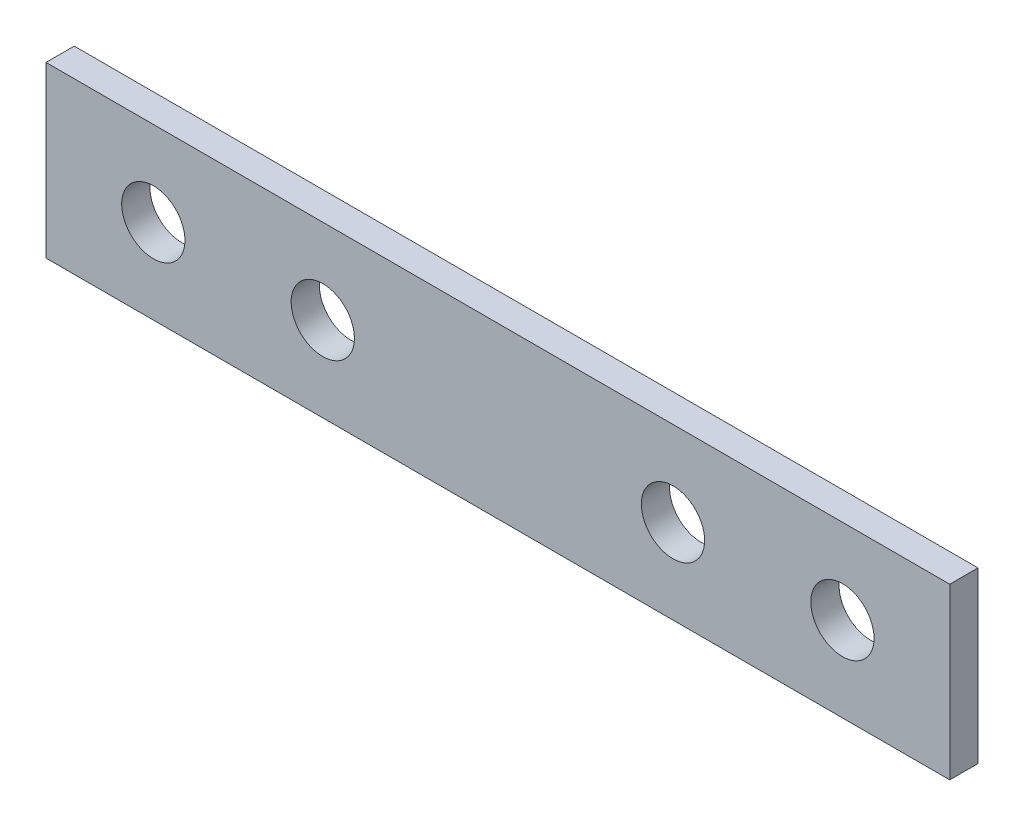
ISO-10303-21;
HEADER;
FILE_DESCRIPTION(('STEP AP214'),'2;1');
FILE_NAME('part.step','',(''),(''),'','','');
FILE_SCHEMA(('AUTOMOTIVE_DESIGN { 1 0 10303 214 1 1 1 1 }'));
ENDSEC;
DATA;
#1=APPLICATION_CONTEXT('core data for automotive mechanical design processes');
#2=APPLICATION_PROTOCOL_DEFINITION('international standard','automotive_design',2000,#1);
#3=PRODUCT_CONTEXT('',#1,'mechanical');
#4=PRODUCT('Part','Part','',(#3));
#5=PRODUCT_RELATED_PRODUCT_CATEGORY('part','',(#4));
#6=PRODUCT_DEFINITION_FORMATION('','',#4);
#7=PRODUCT_DEFINITION_CONTEXT('part definition',#1,'design');
#8=PRODUCT_DEFINITION('design','',#6,#7);
#9=PRODUCT_DEFINITION_SHAPE('','',#8);
#10=(LENGTH_UNIT() NAMED_UNIT(*) SI_UNIT(.MILLI.,.METRE.));
#11=(NAMED_UNIT(*) PLANE_ANGLE_UNIT() SI_UNIT($,.RADIAN.));
#12=(NAMED_UNIT(*) SI_UNIT($,.STERADIAN.) SOLID_ANGLE_UNIT());
#13=UNCERTAINTY_MEASURE_WITH_UNIT(LENGTH_MEASURE(1.E-05),#10,'distance_accuracy_value','');
#14=(GEOMETRIC_REPRESENTATION_CONTEXT(3) GLOBAL_UNCERTAINTY_ASSIGNED_CONTEXT((#13)) GLOBAL_UNIT_ASSIGNED_CONTEXT((#10,
#11,#12)) REPRESENTATION_CONTEXT('',''));
#15=CARTESIAN_POINT('',(0.,0.,0.));
#16=DIRECTION('',(0.,0.,1.));
#17=DIRECTION('',(1.,0.,0.));
#18=AXIS2_PLACEMENT_3D('',#15,#16,#17);
#19=CARTESIAN_POINT('',(40.,7.5,2.5));
#20=DIRECTION('',(0.,0.,1.));
#21=DIRECTION('',(1.,0.,0.));
#22=AXIS2_PLACEMENT_3D('',#19,#20,#21);
#23=PLANE('',#22);
#24=CARTESIAN_POINT('',(-30.5,0.,2.5));
#25=DIRECTION('',(0.,0.,1.));
#26=DIRECTION('',(1.,0.,0.));
#27=AXIS2_PLACEMENT_3D('',#24,#25,#26);
#28=CIRCLE('',#27,2.8);
#29=CARTESIAN_POINT('',(-27.7,0.,2.5));
#30=VERTEX_POINT('',#29);
#31=EDGE_CURVE('E121',#30,#30,#28,.T.);
#32=ORIENTED_EDGE('',*,*,#31,.F.);
#33=EDGE_LOOP('',(#32));
#34=FACE_BOUND('',#33,.T.);
#35=DIRECTION('',(0.,1.,0.));
#36=VECTOR('',#35,1.);
#37=CARTESIAN_POINT('',(40.,-7.5,2.5));
#38=LINE('',#37,#36);
#39=CARTESIAN_POINT('',(40.,-7.5,2.5));
#40=VERTEX_POINT('',#39);
#41=CARTESIAN_POINT('',(40.,7.5,2.5));
#42=VERTEX_POINT('',#41);
#43=EDGE_CURVE('E102',#40,#42,#38,.T.);
#44=ORIENTED_EDGE('',*,*,#43,.T.);
#45=DIRECTION('',(-1.,0.,0.));
#46=VECTOR('',#45,1.);
#47=CARTESIAN_POINT('',(-40.,7.5,2.5));
#48=LINE('',#47,#46);
#49=CARTESIAN_POINT('',(-40.,7.5,2.5));
#50=VERTEX_POINT('',#49);
#51=EDGE_CURVE('E72',#42,#50,#48,.T.);
#52=ORIENTED_EDGE('',*,*,#51,.T.);
#53=DIRECTION('',(0.,-1.,0.));
#54=VECTOR('',#53,1.);
#55=CARTESIAN_POINT('',(-40.,-7.5,2.5));
#56=LINE('',#55,#54);
#57=CARTESIAN_POINT('',(-40.,-7.5,2.5));
#58=VERTEX_POINT('',#57);
#59=EDGE_CURVE('E111',#50,#58,#56,.T.);
#60=ORIENTED_EDGE('',*,*,#59,.T.);
#61=DIRECTION('',(1.,0.,0.));
#62=VECTOR('',#61,1.);
#63=CARTESIAN_POINT('',(-40.,-7.5,2.5));
#64=LINE('',#63,#62);
#65=EDGE_CURVE('E96',#58,#40,#64,.T.);
#66=ORIENTED_EDGE('',*,*,#65,.T.);
#67=EDGE_LOOP('',(#44,#52,#60,#66));
#68=FACE_BOUND('',#67,.T.);
#69=CARTESIAN_POINT('',(-15.5,0.,2.5));
#70=DIRECTION('',(0.,0.,1.));
#71=DIRECTION('',(1.,0.,0.));
#72=AXIS2_PLACEMENT_3D('',#69,#70,#71);
#73=CIRCLE('',#72,2.8);
#74=CARTESIAN_POINT('',(-12.7,0.,2.5));
#75=VERTEX_POINT('',#74);
#76=EDGE_CURVE('E123',#75,#75,#73,.T.);
#77=ORIENTED_EDGE('',*,*,#76,.F.);
#78=EDGE_LOOP('',(#77));
#79=FACE_BOUND('',#78,.T.);
#80=CARTESIAN_POINT('',(15.5,0.,2.5));
#81=DIRECTION('',(0.,0.,1.));
#82=DIRECTION('',(1.,0.,0.));
#83=AXIS2_PLACEMENT_3D('',#80,#81,#82);
#84=CIRCLE('',#83,2.8);
#85=CARTESIAN_POINT('',(18.3,0.,2.5));
#86=VERTEX_POINT('',#85);
#87=EDGE_CURVE('E41',#86,#86,#84,.T.);
#88=ORIENTED_EDGE('',*,*,#87,.F.);
#89=EDGE_LOOP('',(#88));
#90=FACE_BOUND('',#89,.T.);
#91=CARTESIAN_POINT('',(30.5,0.,2.5));
#92=DIRECTION('',(0.,0.,1.));
#93=DIRECTION('',(1.,0.,0.));
#94=AXIS2_PLACEMENT_3D('',#91,#92,#93);
#95=CIRCLE('',#94,2.8);
#96=CARTESIAN_POINT('',(33.3,0.,2.5));
#97=VERTEX_POINT('',#96);
#98=EDGE_CURVE('E128',#97,#97,#95,.T.);
#99=ORIENTED_EDGE('',*,*,#98,.F.);
#100=EDGE_LOOP('',(#99));
#101=FACE_BOUND('',#100,.T.);
#102=ADVANCED_FACE('F37',(#34,#68,#79,#90,#101),#23,.T.);
#103=CARTESIAN_POINT('',(-40.,7.5,2.5));
#104=DIRECTION('',(0.,-1.,0.));
#105=DIRECTION('',(0.,0.,-1.));
#106=AXIS2_PLACEMENT_3D('',#103,#104,#105);
#107=PLANE('',#106);
#108=DIRECTION('',(-1.,0.,0.));
#109=VECTOR('',#108,1.);
#110=CARTESIAN_POINT('',(-40.,7.5,0.));
#111=LINE('',#110,#109);
#112=CARTESIAN_POINT('',(40.,7.5,0.));
#113=VERTEX_POINT('',#112);
#114=CARTESIAN_POINT('',(-40.,7.5,0.));
#115=VERTEX_POINT('',#114);
#116=EDGE_CURVE('E56',#113,#115,#111,.T.);
#117=ORIENTED_EDGE('',*,*,#116,.T.);
#118=DIRECTION('',(0.,0.,-1.));
#119=VECTOR('',#118,1.);
#120=CARTESIAN_POINT('',(-40.,7.5,2.5));
#121=LINE('',#120,#119);
#122=EDGE_CURVE('E93',#50,#115,#121,.T.);
#123=ORIENTED_EDGE('',*,*,#122,.F.);
#124=ORIENTED_EDGE('',*,*,#51,.F.);
#125=DIRECTION('',(0.,0.,-1.));
#126=VECTOR('',#125,1.);
#127=CARTESIAN_POINT('',(40.,7.5,2.5));
#128=LINE('',#127,#126);
#129=EDGE_CURVE('E132',#42,#113,#128,.T.);
#130=ORIENTED_EDGE('',*,*,#129,.T.);
#131=EDGE_LOOP('',(#117,#123,#124,#130));
#132=FACE_BOUND('',#131,.T.);
#133=ADVANCED_FACE('F139',(#132),#107,.F.);
#134=CARTESIAN_POINT('',(-40.,-7.5,2.5));
#135=DIRECTION('',(1.,0.,0.));
#136=DIRECTION('',(0.,0.,-1.));
#137=AXIS2_PLACEMENT_3D('',#134,#135,#136);
#138=PLANE('',#137);
#139=DIRECTION('',(0.,-1.,0.));
#140=VECTOR('',#139,1.);
#141=CARTESIAN_POINT('',(-40.,-7.5,0.));
#142=LINE('',#141,#140);
#143=CARTESIAN_POINT('',(-40.,-7.5,0.));
#144=VERTEX_POINT('',#143);
#145=EDGE_CURVE('E88',#115,#144,#142,.T.);
#146=ORIENTED_EDGE('',*,*,#145,.T.);
#147=DIRECTION('',(0.,0.,-1.));
#148=VECTOR('',#147,1.);
#149=CARTESIAN_POINT('',(-40.,-7.5,2.5));
#150=LINE('',#149,#148);
#151=EDGE_CURVE('E91',#58,#144,#150,.T.);
#152=ORIENTED_EDGE('',*,*,#151,.F.);
#153=ORIENTED_EDGE('',*,*,#59,.F.);
#154=ORIENTED_EDGE('',*,*,#122,.T.);
#155=EDGE_LOOP('',(#146,#152,#153,#154));
#156=FACE_BOUND('',#155,.T.);
#157=ADVANCED_FACE('F89',(#156),#138,.F.);
#158=CARTESIAN_POINT('',(40.,-7.5,2.5));
#159=DIRECTION('',(-1.,0.,0.));
#160=DIRECTION('',(0.,0.,1.));
#161=AXIS2_PLACEMENT_3D('',#158,#159,#160);
#162=PLANE('',#161);
#163=DIRECTION('',(0.,1.,0.));
#164=VECTOR('',#163,1.);
#165=CARTESIAN_POINT('',(40.,-7.5,0.));
#166=LINE('',#165,#164);
#167=CARTESIAN_POINT('',(40.,-7.5,0.));
#168=VERTEX_POINT('',#167);
#169=EDGE_CURVE('E101',#168,#113,#166,.T.);
#170=ORIENTED_EDGE('',*,*,#169,.T.);
#171=ORIENTED_EDGE('',*,*,#129,.F.);
#172=ORIENTED_EDGE('',*,*,#43,.F.);
#173=DIRECTION('',(0.,0.,-1.));
#174=VECTOR('',#173,1.);
#175=CARTESIAN_POINT('',(40.,-7.5,2.5));
#176=LINE('',#175,#174);
#177=EDGE_CURVE('E97',#40,#168,#176,.T.);
#178=ORIENTED_EDGE('',*,*,#177,.T.);
#179=EDGE_LOOP('',(#170,#171,#172,#178));
#180=FACE_BOUND('',#179,.T.);
#181=ADVANCED_FACE('F142',(#180),#162,.F.);
#182=CARTESIAN_POINT('',(-30.5,0.,0.));
#183=DIRECTION('',(0.,0.,-1.));
#184=DIRECTION('',(-1.,0.,0.));
#185=AXIS2_PLACEMENT_3D('',#182,#183,#184);
#186=PLANE('',#185);
#187=CARTESIAN_POINT('',(-30.5,0.,0.));
#188=DIRECTION('',(0.,0.,1.));
#189=DIRECTION('',(1.,0.,0.));
#190=AXIS2_PLACEMENT_3D('',#187,#188,#189);
#191=CIRCLE('',#190,2.8);
#192=CARTESIAN_POINT('',(-27.7,0.,0.));
#193=VERTEX_POINT('',#192);
#194=EDGE_CURVE('E109',#193,#193,#191,.T.);
#195=ORIENTED_EDGE('',*,*,#194,.T.);
#196=EDGE_LOOP('',(#195));
#197=FACE_BOUND('',#196,.T.);
#198=CARTESIAN_POINT('',(-15.5,0.,0.));
#199=DIRECTION('',(0.,0.,1.));
#200=DIRECTION('',(1.,0.,0.));
#201=AXIS2_PLACEMENT_3D('',#198,#199,#200);
#202=CIRCLE('',#201,2.8);
#203=CARTESIAN_POINT('',(-12.7,0.,0.));
#204=VERTEX_POINT('',#203);
#205=EDGE_CURVE('E116',#204,#204,#202,.T.);
#206=ORIENTED_EDGE('',*,*,#205,.T.);
#207=EDGE_LOOP('',(#206));
#208=FACE_BOUND('',#207,.T.);
#209=CARTESIAN_POINT('',(15.5,0.,0.));
#210=DIRECTION('',(0.,0.,1.));
#211=DIRECTION('',(1.,0.,0.));
#212=AXIS2_PLACEMENT_3D('',#209,#210,#211);
#213=CIRCLE('',#212,2.8);
#214=CARTESIAN_POINT('',(18.3,0.,0.));
#215=VERTEX_POINT('',#214);
#216=EDGE_CURVE('E47',#215,#215,#213,.T.);
#217=ORIENTED_EDGE('',*,*,#216,.T.);
#218=EDGE_LOOP('',(#217));
#219=FACE_BOUND('',#218,.T.);
#220=CARTESIAN_POINT('',(30.5,0.,0.));
#221=DIRECTION('',(0.,0.,1.));
#222=DIRECTION('',(1.,0.,0.));
#223=AXIS2_PLACEMENT_3D('',#220,#221,#222);
#224=CIRCLE('',#223,2.8);
#225=CARTESIAN_POINT('',(33.3,0.,0.));
#226=VERTEX_POINT('',#225);
#227=EDGE_CURVE('E11',#226,#226,#224,.T.);
#228=ORIENTED_EDGE('',*,*,#227,.T.);
#229=EDGE_LOOP('',(#228));
#230=FACE_BOUND('',#229,.T.);
#231=ORIENTED_EDGE('',*,*,#169,.F.);
#232=DIRECTION('',(1.,0.,0.));
#233=VECTOR('',#232,1.);
#234=CARTESIAN_POINT('',(-40.,-7.5,0.));
#235=LINE('',#234,#233);
#236=EDGE_CURVE('E82',#144,#168,#235,.T.);
#237=ORIENTED_EDGE('',*,*,#236,.F.);
#238=ORIENTED_EDGE('',*,*,#145,.F.);
#239=ORIENTED_EDGE('',*,*,#116,.F.);
#240=EDGE_LOOP('',(#231,#237,#238,#239));
#241=FACE_BOUND('',#240,.T.);
#242=ADVANCED_FACE('F99',(#197,#208,#219,#230,#241),#186,.T.);
#243=CARTESIAN_POINT('',(30.5,0.,5.));
#244=DIRECTION('',(0.,0.,-1.));
#245=DIRECTION('',(-1.,0.,0.));
#246=AXIS2_PLACEMENT_3D('',#243,#244,#245);
#247=CYLINDRICAL_SURFACE('',#246,2.8);
#248=ORIENTED_EDGE('',*,*,#227,.F.);
#249=EDGE_LOOP('',(#248));
#250=FACE_BOUND('',#249,.T.);
#251=ORIENTED_EDGE('',*,*,#98,.T.);
#252=EDGE_LOOP('',(#251));
#253=FACE_BOUND('',#252,.T.);
#254=ADVANCED_FACE('F39',(#250,#253),#247,.F.);
#255=CARTESIAN_POINT('',(15.5,0.,5.));
#256=DIRECTION('',(0.,0.,-1.));
#257=DIRECTION('',(-1.,0.,0.));
#258=AXIS2_PLACEMENT_3D('',#255,#256,#257);
#259=CYLINDRICAL_SURFACE('',#258,2.8);
#260=ORIENTED_EDGE('',*,*,#216,.F.);
#261=EDGE_LOOP('',(#260));
#262=FACE_BOUND('',#261,.T.);
#263=ORIENTED_EDGE('',*,*,#87,.T.);
#264=EDGE_LOOP('',(#263));
#265=FACE_BOUND('',#264,.T.);
#266=ADVANCED_FACE('F168',(#262,#265),#259,.F.);
#267=CARTESIAN_POINT('',(-15.5,0.,5.));
#268=DIRECTION('',(0.,0.,-1.));
#269=DIRECTION('',(-1.,0.,0.));
#270=AXIS2_PLACEMENT_3D('',#267,#268,#269);
#271=CYLINDRICAL_SURFACE('',#270,2.8);
#272=ORIENTED_EDGE('',*,*,#205,.F.);
#273=EDGE_LOOP('',(#272));
#274=FACE_BOUND('',#273,.T.);
#275=ORIENTED_EDGE('',*,*,#76,.T.);
#276=EDGE_LOOP('',(#275));
#277=FACE_BOUND('',#276,.T.);
#278=ADVANCED_FACE('F162',(#274,#277),#271,.F.);
#279=CARTESIAN_POINT('',(-40.,-7.5,2.5));
#280=DIRECTION('',(0.,1.,0.));
#281=DIRECTION('',(0.,0.,1.));
#282=AXIS2_PLACEMENT_3D('',#279,#280,#281);
#283=PLANE('',#282);
#284=ORIENTED_EDGE('',*,*,#236,.T.);
#285=ORIENTED_EDGE('',*,*,#177,.F.);
#286=ORIENTED_EDGE('',*,*,#65,.F.);
#287=ORIENTED_EDGE('',*,*,#151,.T.);
#288=EDGE_LOOP('',(#284,#285,#286,#287));
#289=FACE_BOUND('',#288,.T.);
#290=ADVANCED_FACE('F95',(#289),#283,.F.);
#291=CARTESIAN_POINT('',(-30.5,0.,5.));
#292=DIRECTION('',(0.,0.,-1.));
#293=DIRECTION('',(-1.,0.,0.));
#294=AXIS2_PLACEMENT_3D('',#291,#292,#293);
#295=CYLINDRICAL_SURFACE('',#294,2.8);
#296=ORIENTED_EDGE('',*,*,#194,.F.);
#297=EDGE_LOOP('',(#296));
#298=FACE_BOUND('',#297,.T.);
#299=ORIENTED_EDGE('',*,*,#31,.T.);
#300=EDGE_LOOP('',(#299));
#301=FACE_BOUND('',#300,.T.);
#302=ADVANCED_FACE('F147',(#298,#301),#295,.F.);
#303=CLOSED_SHELL('',(#102,#133,#157,#181,#242,#254,#266,#278,#290,#302));
#304=MANIFOLD_SOLID_BREP('B2',#303);
#305=ADVANCED_BREP_SHAPE_REPRESENTATION('',(#18,#304),#14);
#306=SHAPE_DEFINITION_REPRESENTATION(#9,#305);
ENDSEC;
END-ISO-10303-21;
